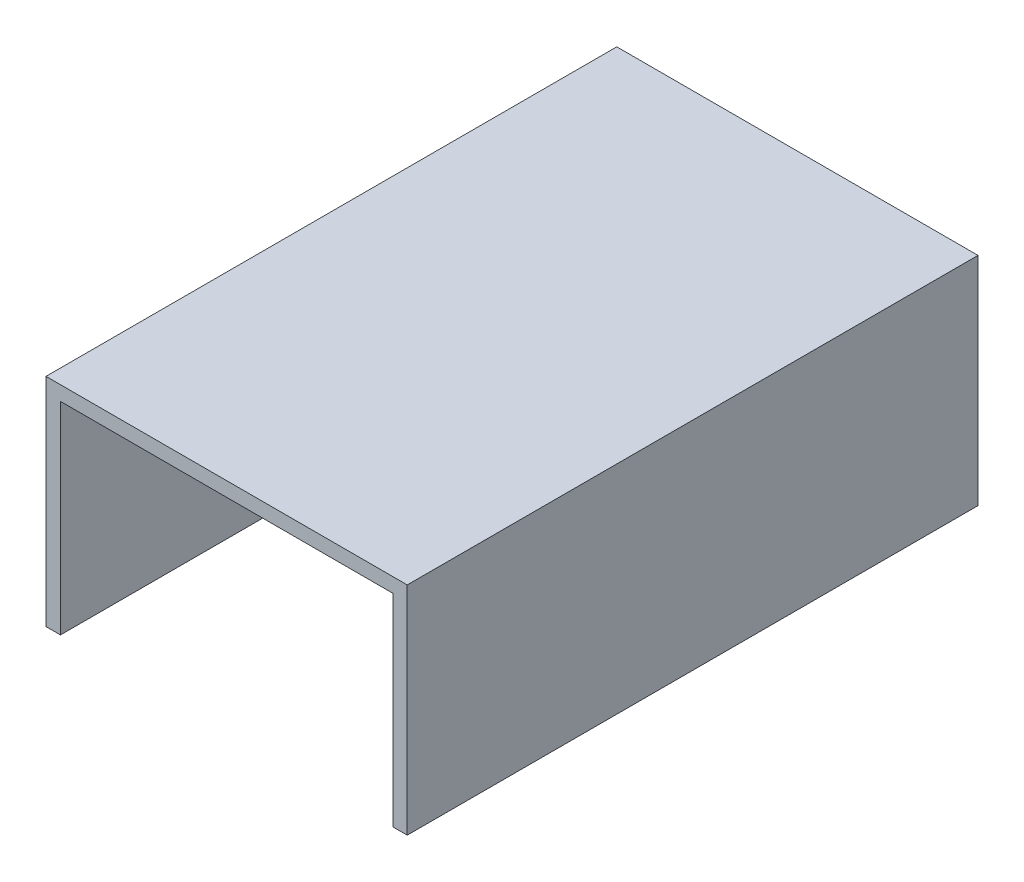
ISO-10303-21;
HEADER;
FILE_DESCRIPTION(('STEP AP214'),'2;1');
FILE_NAME('part.step','',(''),(''),'','','');
FILE_SCHEMA(('AUTOMOTIVE_DESIGN { 1 0 10303 214 1 1 1 1 }'));
ENDSEC;
DATA;
#1=APPLICATION_CONTEXT('core data for automotive mechanical design processes');
#2=APPLICATION_PROTOCOL_DEFINITION('international standard','automotive_design',2000,#1);
#3=PRODUCT_CONTEXT('',#1,'mechanical');
#4=PRODUCT('Part','Part','',(#3));
#5=PRODUCT_RELATED_PRODUCT_CATEGORY('part','',(#4));
#6=PRODUCT_DEFINITION_FORMATION('','',#4);
#7=PRODUCT_DEFINITION_CONTEXT('part definition',#1,'design');
#8=PRODUCT_DEFINITION('design','',#6,#7);
#9=PRODUCT_DEFINITION_SHAPE('','',#8);
#10=(LENGTH_UNIT() NAMED_UNIT(*) SI_UNIT(.MILLI.,.METRE.));
#11=(NAMED_UNIT(*) PLANE_ANGLE_UNIT() SI_UNIT($,.RADIAN.));
#12=(NAMED_UNIT(*) SI_UNIT($,.STERADIAN.) SOLID_ANGLE_UNIT());
#13=UNCERTAINTY_MEASURE_WITH_UNIT(LENGTH_MEASURE(1.E-05),#10,'distance_accuracy_value','');
#14=(GEOMETRIC_REPRESENTATION_CONTEXT(3) GLOBAL_UNCERTAINTY_ASSIGNED_CONTEXT((#13)) GLOBAL_UNIT_ASSIGNED_CONTEXT((#10,
#11,#12)) REPRESENTATION_CONTEXT('',''));
#15=CARTESIAN_POINT('',(0.,0.,0.));
#16=DIRECTION('',(0.,0.,1.));
#17=DIRECTION('',(1.,0.,0.));
#18=AXIS2_PLACEMENT_3D('',#15,#16,#17);
#19=CARTESIAN_POINT('',(46.,28.,-79.));
#20=DIRECTION('',(-1.,0.,0.));
#21=DIRECTION('',(0.,0.,1.));
#22=AXIS2_PLACEMENT_3D('',#19,#20,#21);
#23=PLANE('',#22);
#24=DIRECTION('',(0.,-1.,0.));
#25=VECTOR('',#24,1.);
#26=CARTESIAN_POINT('',(46.,28.,0.));
#27=LINE('',#26,#25);
#28=CARTESIAN_POINT('',(46.,28.,0.));
#29=VERTEX_POINT('',#28);
#30=CARTESIAN_POINT('',(46.,0.,0.));
#31=VERTEX_POINT('',#30);
#32=EDGE_CURVE('E127',#29,#31,#27,.T.);
#33=ORIENTED_EDGE('',*,*,#32,.F.);
#34=DIRECTION('',(0.,0.,1.));
#35=VECTOR('',#34,1.);
#36=CARTESIAN_POINT('',(46.,28.,-79.));
#37=LINE('',#36,#35);
#38=CARTESIAN_POINT('',(46.,28.,-79.));
#39=VERTEX_POINT('',#38);
#40=EDGE_CURVE('E11',#39,#29,#37,.T.);
#41=ORIENTED_EDGE('',*,*,#40,.F.);
#42=DIRECTION('',(0.,-1.,0.));
#43=VECTOR('',#42,1.);
#44=CARTESIAN_POINT('',(46.,28.,-79.));
#45=LINE('',#44,#43);
#46=CARTESIAN_POINT('',(46.,0.,-79.));
#47=VERTEX_POINT('',#46);
#48=EDGE_CURVE('E144',#39,#47,#45,.T.);
#49=ORIENTED_EDGE('',*,*,#48,.T.);
#50=DIRECTION('',(0.,0.,1.));
#51=VECTOR('',#50,1.);
#52=CARTESIAN_POINT('',(46.,0.,-79.));
#53=LINE('',#52,#51);
#54=EDGE_CURVE('E37',#47,#31,#53,.T.);
#55=ORIENTED_EDGE('',*,*,#54,.T.);
#56=EDGE_LOOP('',(#33,#41,#49,#55));
#57=FACE_BOUND('',#56,.T.);
#58=ADVANCED_FACE('F34',(#57),#23,.T.);
#59=CARTESIAN_POINT('',(0.,28.,-79.));
#60=DIRECTION('',(0.,-1.,0.));
#61=DIRECTION('',(1.,0.,0.));
#62=AXIS2_PLACEMENT_3D('',#59,#60,#61);
#63=PLANE('',#62);
#64=DIRECTION('',(1.,0.,0.));
#65=VECTOR('',#64,1.);
#66=CARTESIAN_POINT('',(0.,28.,0.));
#67=LINE('',#66,#65);
#68=CARTESIAN_POINT('',(0.,28.,0.));
#69=VERTEX_POINT('',#68);
#70=EDGE_CURVE('E142',#69,#29,#67,.T.);
#71=ORIENTED_EDGE('',*,*,#70,.F.);
#72=DIRECTION('',(0.,0.,1.));
#73=VECTOR('',#72,1.);
#74=CARTESIAN_POINT('',(0.,28.,-79.));
#75=LINE('',#74,#73);
#76=CARTESIAN_POINT('',(0.,28.,-79.));
#77=VERTEX_POINT('',#76);
#78=EDGE_CURVE('E43',#77,#69,#75,.T.);
#79=ORIENTED_EDGE('',*,*,#78,.F.);
#80=DIRECTION('',(1.,0.,0.));
#81=VECTOR('',#80,1.);
#82=CARTESIAN_POINT('',(0.,28.,-79.));
#83=LINE('',#82,#81);
#84=EDGE_CURVE('E122',#77,#39,#83,.T.);
#85=ORIENTED_EDGE('',*,*,#84,.T.);
#86=ORIENTED_EDGE('',*,*,#40,.T.);
#87=EDGE_LOOP('',(#71,#79,#85,#86));
#88=FACE_BOUND('',#87,.T.);
#89=ADVANCED_FACE('F162',(#88),#63,.T.);
#90=CARTESIAN_POINT('',(0.,0.,-79.));
#91=DIRECTION('',(1.,0.,0.));
#92=DIRECTION('',(0.,0.,-1.));
#93=AXIS2_PLACEMENT_3D('',#90,#91,#92);
#94=PLANE('',#93);
#95=DIRECTION('',(0.,1.,0.));
#96=VECTOR('',#95,1.);
#97=CARTESIAN_POINT('',(0.,0.,0.));
#98=LINE('',#97,#96);
#99=CARTESIAN_POINT('',(0.,0.,0.));
#100=VERTEX_POINT('',#99);
#101=EDGE_CURVE('E109',#100,#69,#98,.T.);
#102=ORIENTED_EDGE('',*,*,#101,.F.);
#103=DIRECTION('',(0.,0.,1.));
#104=VECTOR('',#103,1.);
#105=CARTESIAN_POINT('',(0.,0.,-79.));
#106=LINE('',#105,#104);
#107=CARTESIAN_POINT('',(0.,0.,-79.));
#108=VERTEX_POINT('',#107);
#109=EDGE_CURVE('E103',#108,#100,#106,.T.);
#110=ORIENTED_EDGE('',*,*,#109,.F.);
#111=DIRECTION('',(0.,1.,0.));
#112=VECTOR('',#111,1.);
#113=CARTESIAN_POINT('',(0.,0.,-79.));
#114=LINE('',#113,#112);
#115=EDGE_CURVE('E107',#108,#77,#114,.T.);
#116=ORIENTED_EDGE('',*,*,#115,.T.);
#117=ORIENTED_EDGE('',*,*,#78,.T.);
#118=EDGE_LOOP('',(#102,#110,#116,#117));
#119=FACE_BOUND('',#118,.T.);
#120=ADVANCED_FACE('F105',(#119),#94,.T.);
#121=CARTESIAN_POINT('',(0.,0.,-79.));
#122=DIRECTION('',(0.,1.,0.));
#123=DIRECTION('',(0.,0.,1.));
#124=AXIS2_PLACEMENT_3D('',#121,#122,#123);
#125=PLANE('',#124);
#126=DIRECTION('',(-1.,0.,0.));
#127=VECTOR('',#126,1.);
#128=CARTESIAN_POINT('',(0.,0.,0.));
#129=LINE('',#128,#127);
#130=CARTESIAN_POINT('',(-2.,0.,0.));
#131=VERTEX_POINT('',#130);
#132=EDGE_CURVE('E139',#100,#131,#129,.T.);
#133=ORIENTED_EDGE('',*,*,#132,.T.);
#134=DIRECTION('',(0.,0.,1.));
#135=VECTOR('',#134,1.);
#136=CARTESIAN_POINT('',(-2.,0.,-79.));
#137=LINE('',#136,#135);
#138=CARTESIAN_POINT('',(-2.,0.,-79.));
#139=VERTEX_POINT('',#138);
#140=EDGE_CURVE('E112',#139,#131,#137,.T.);
#141=ORIENTED_EDGE('',*,*,#140,.F.);
#142=DIRECTION('',(-1.,0.,0.));
#143=VECTOR('',#142,1.);
#144=CARTESIAN_POINT('',(0.,0.,-79.));
#145=LINE('',#144,#143);
#146=EDGE_CURVE('E115',#108,#139,#145,.T.);
#147=ORIENTED_EDGE('',*,*,#146,.F.);
#148=ORIENTED_EDGE('',*,*,#109,.T.);
#149=EDGE_LOOP('',(#133,#141,#147,#148));
#150=FACE_BOUND('',#149,.T.);
#151=ADVANCED_FACE('F116',(#150),#125,.F.);
#152=CARTESIAN_POINT('',(-2.,0.,-79.));
#153=DIRECTION('',(1.,0.,0.));
#154=DIRECTION('',(0.,0.,-1.));
#155=AXIS2_PLACEMENT_3D('',#152,#153,#154);
#156=PLANE('',#155);
#157=DIRECTION('',(0.,1.,0.));
#158=VECTOR('',#157,1.);
#159=CARTESIAN_POINT('',(-2.,0.,0.));
#160=LINE('',#159,#158);
#161=CARTESIAN_POINT('',(-2.,30.,0.));
#162=VERTEX_POINT('',#161);
#163=EDGE_CURVE('E137',#131,#162,#160,.T.);
#164=ORIENTED_EDGE('',*,*,#163,.T.);
#165=DIRECTION('',(0.,0.,1.));
#166=VECTOR('',#165,1.);
#167=CARTESIAN_POINT('',(-2.,30.,-79.));
#168=LINE('',#167,#166);
#169=CARTESIAN_POINT('',(-2.,30.,-79.));
#170=VERTEX_POINT('',#169);
#171=EDGE_CURVE('E148',#170,#162,#168,.T.);
#172=ORIENTED_EDGE('',*,*,#171,.F.);
#173=DIRECTION('',(0.,1.,0.));
#174=VECTOR('',#173,1.);
#175=CARTESIAN_POINT('',(-2.,0.,-79.));
#176=LINE('',#175,#174);
#177=EDGE_CURVE('E119',#139,#170,#176,.T.);
#178=ORIENTED_EDGE('',*,*,#177,.F.);
#179=ORIENTED_EDGE('',*,*,#140,.T.);
#180=EDGE_LOOP('',(#164,#172,#178,#179));
#181=FACE_BOUND('',#180,.T.);
#182=ADVANCED_FACE('F175',(#181),#156,.F.);
#183=CARTESIAN_POINT('',(0.,30.,-79.));
#184=DIRECTION('',(0.,-1.,0.));
#185=DIRECTION('',(1.,0.,0.));
#186=AXIS2_PLACEMENT_3D('',#183,#184,#185);
#187=PLANE('',#186);
#188=DIRECTION('',(1.,0.,0.));
#189=VECTOR('',#188,1.);
#190=CARTESIAN_POINT('',(0.,30.,0.));
#191=LINE('',#190,#189);
#192=CARTESIAN_POINT('',(48.,30.,0.));
#193=VERTEX_POINT('',#192);
#194=EDGE_CURVE('E135',#162,#193,#191,.T.);
#195=ORIENTED_EDGE('',*,*,#194,.T.);
#196=DIRECTION('',(0.,0.,1.));
#197=VECTOR('',#196,1.);
#198=CARTESIAN_POINT('',(48.,30.,-79.));
#199=LINE('',#198,#197);
#200=CARTESIAN_POINT('',(48.,30.,-79.));
#201=VERTEX_POINT('',#200);
#202=EDGE_CURVE('E151',#201,#193,#199,.T.);
#203=ORIENTED_EDGE('',*,*,#202,.F.);
#204=DIRECTION('',(1.,0.,0.));
#205=VECTOR('',#204,1.);
#206=CARTESIAN_POINT('',(0.,30.,-79.));
#207=LINE('',#206,#205);
#208=EDGE_CURVE('E253',#170,#201,#207,.T.);
#209=ORIENTED_EDGE('',*,*,#208,.F.);
#210=ORIENTED_EDGE('',*,*,#171,.T.);
#211=EDGE_LOOP('',(#195,#203,#209,#210));
#212=FACE_BOUND('',#211,.T.);
#213=ADVANCED_FACE('F178',(#212),#187,.F.);
#214=CARTESIAN_POINT('',(48.,28.,-79.));
#215=DIRECTION('',(-1.,0.,0.));
#216=DIRECTION('',(0.,0.,1.));
#217=AXIS2_PLACEMENT_3D('',#214,#215,#216);
#218=PLANE('',#217);
#219=DIRECTION('',(0.,1.,0.));
#220=VECTOR('',#219,1.);
#221=CARTESIAN_POINT('',(48.,28.,0.));
#222=LINE('',#221,#220);
#223=CARTESIAN_POINT('',(48.,0.,0.));
#224=VERTEX_POINT('',#223);
#225=EDGE_CURVE('E133',#193,#224,#222,.F.);
#226=ORIENTED_EDGE('',*,*,#225,.T.);
#227=DIRECTION('',(0.,0.,1.));
#228=VECTOR('',#227,1.);
#229=CARTESIAN_POINT('',(48.,0.,-79.));
#230=LINE('',#229,#228);
#231=CARTESIAN_POINT('',(48.,0.,-79.));
#232=VERTEX_POINT('',#231);
#233=EDGE_CURVE('E153',#232,#224,#230,.T.);
#234=ORIENTED_EDGE('',*,*,#233,.F.);
#235=DIRECTION('',(0.,1.,0.));
#236=VECTOR('',#235,1.);
#237=CARTESIAN_POINT('',(48.,28.,-79.));
#238=LINE('',#237,#236);
#239=EDGE_CURVE('E254',#201,#232,#238,.F.);
#240=ORIENTED_EDGE('',*,*,#239,.F.);
#241=ORIENTED_EDGE('',*,*,#202,.T.);
#242=EDGE_LOOP('',(#226,#234,#240,#241));
#243=FACE_BOUND('',#242,.T.);
#244=ADVANCED_FACE('F182',(#243),#218,.F.);
#245=CARTESIAN_POINT('',(48.,0.,-79.));
#246=DIRECTION('',(0.,1.,0.));
#247=DIRECTION('',(-1.,0.,0.));
#248=AXIS2_PLACEMENT_3D('',#245,#246,#247);
#249=PLANE('',#248);
#250=DIRECTION('',(-1.,0.,0.));
#251=VECTOR('',#250,1.);
#252=CARTESIAN_POINT('',(48.,0.,0.));
#253=LINE('',#252,#251);
#254=EDGE_CURVE('E130',#224,#31,#253,.T.);
#255=ORIENTED_EDGE('',*,*,#254,.T.);
#256=ORIENTED_EDGE('',*,*,#54,.F.);
#257=DIRECTION('',(-1.,0.,0.));
#258=VECTOR('',#257,1.);
#259=CARTESIAN_POINT('',(48.,0.,-79.));
#260=LINE('',#259,#258);
#261=EDGE_CURVE('E90',#232,#47,#260,.T.);
#262=ORIENTED_EDGE('',*,*,#261,.F.);
#263=ORIENTED_EDGE('',*,*,#233,.T.);
#264=EDGE_LOOP('',(#255,#256,#262,#263));
#265=FACE_BOUND('',#264,.T.);
#266=ADVANCED_FACE('F158',(#265),#249,.F.);
#267=CARTESIAN_POINT('',(0.,0.,-79.));
#268=DIRECTION('',(0.,0.,-1.));
#269=DIRECTION('',(-1.,0.,0.));
#270=AXIS2_PLACEMENT_3D('',#267,#268,#269);
#271=PLANE('',#270);
#272=ORIENTED_EDGE('',*,*,#48,.F.);
#273=ORIENTED_EDGE('',*,*,#84,.F.);
#274=ORIENTED_EDGE('',*,*,#115,.F.);
#275=ORIENTED_EDGE('',*,*,#146,.T.);
#276=ORIENTED_EDGE('',*,*,#177,.T.);
#277=ORIENTED_EDGE('',*,*,#208,.T.);
#278=ORIENTED_EDGE('',*,*,#239,.T.);
#279=ORIENTED_EDGE('',*,*,#261,.T.);
#280=EDGE_LOOP('',(#272,#273,#274,#275,#276,#277,#278,#279));
#281=FACE_BOUND('',#280,.T.);
#282=ADVANCED_FACE('F121',(#281),#271,.T.);
#283=CARTESIAN_POINT('',(0.,0.,0.));
#284=DIRECTION('',(0.,0.,-1.));
#285=DIRECTION('',(-1.,0.,0.));
#286=AXIS2_PLACEMENT_3D('',#283,#284,#285);
#287=PLANE('',#286);
#288=ORIENTED_EDGE('',*,*,#32,.T.);
#289=ORIENTED_EDGE('',*,*,#254,.F.);
#290=ORIENTED_EDGE('',*,*,#225,.F.);
#291=ORIENTED_EDGE('',*,*,#194,.F.);
#292=ORIENTED_EDGE('',*,*,#163,.F.);
#293=ORIENTED_EDGE('',*,*,#132,.F.);
#294=ORIENTED_EDGE('',*,*,#101,.T.);
#295=ORIENTED_EDGE('',*,*,#70,.T.);
#296=EDGE_LOOP('',(#288,#289,#290,#291,#292,#293,#294,#295));
#297=FACE_BOUND('',#296,.T.);
#298=ADVANCED_FACE('F161',(#297),#287,.F.);
#299=CLOSED_SHELL('',(#58,#89,#120,#151,#182,#213,#244,#266,#282,#298));
#300=MANIFOLD_SOLID_BREP('B2',#299);
#301=ADVANCED_BREP_SHAPE_REPRESENTATION('',(#18,#300),#14);
#302=SHAPE_DEFINITION_REPRESENTATION(#9,#301);
ENDSEC;
END-ISO-10303-21;
